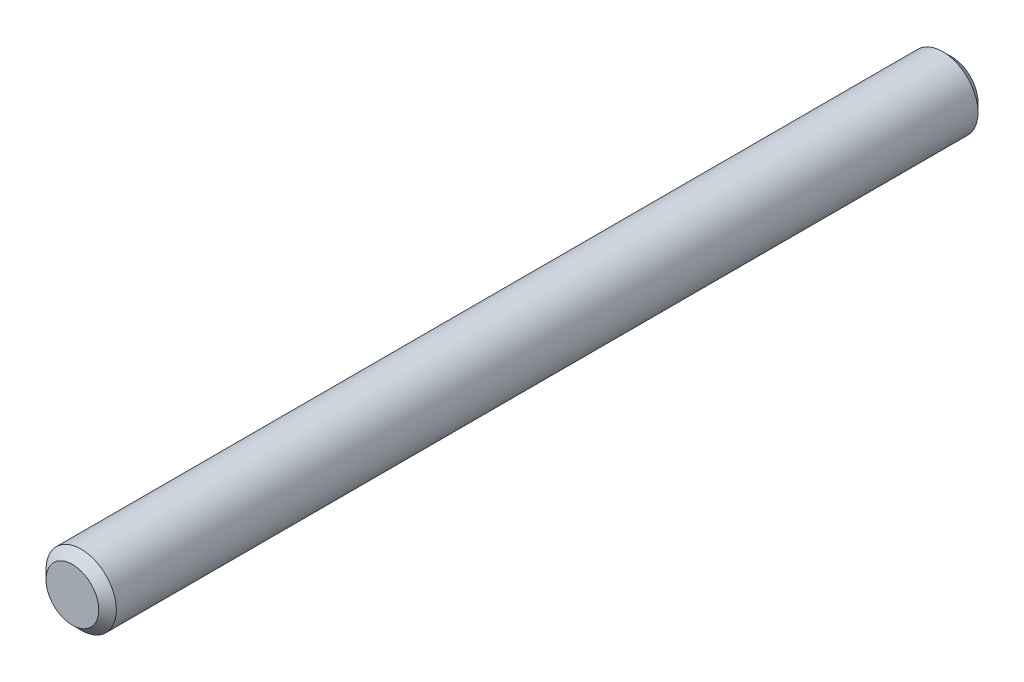
ISO-10303-21;
HEADER;
FILE_DESCRIPTION(('STEP AP214'),'2;1');
FILE_NAME('part.step','',(''),(''),'','','');
FILE_SCHEMA(('AUTOMOTIVE_DESIGN { 1 0 10303 214 1 1 1 1 }'));
ENDSEC;
DATA;
#1=APPLICATION_CONTEXT('core data for automotive mechanical design processes');
#2=APPLICATION_PROTOCOL_DEFINITION('international standard','automotive_design',2000,#1);
#3=PRODUCT_CONTEXT('',#1,'mechanical');
#4=PRODUCT('Part','Part','',(#3));
#5=PRODUCT_RELATED_PRODUCT_CATEGORY('part','',(#4));
#6=PRODUCT_DEFINITION_FORMATION('','',#4);
#7=PRODUCT_DEFINITION_CONTEXT('part definition',#1,'design');
#8=PRODUCT_DEFINITION('design','',#6,#7);
#9=PRODUCT_DEFINITION_SHAPE('','',#8);
#10=(LENGTH_UNIT() NAMED_UNIT(*) SI_UNIT(.MILLI.,.METRE.));
#11=(NAMED_UNIT(*) PLANE_ANGLE_UNIT() SI_UNIT($,.RADIAN.));
#12=(NAMED_UNIT(*) SI_UNIT($,.STERADIAN.) SOLID_ANGLE_UNIT());
#13=UNCERTAINTY_MEASURE_WITH_UNIT(LENGTH_MEASURE(1.E-05),#10,'distance_accuracy_value','');
#14=(GEOMETRIC_REPRESENTATION_CONTEXT(3) GLOBAL_UNCERTAINTY_ASSIGNED_CONTEXT((#13)) GLOBAL_UNIT_ASSIGNED_CONTEXT((#10,
#11,#12)) REPRESENTATION_CONTEXT('',''));
#15=CARTESIAN_POINT('',(0.,0.,0.));
#16=DIRECTION('',(0.,0.,1.));
#17=DIRECTION('',(1.,0.,0.));
#18=AXIS2_PLACEMENT_3D('',#15,#16,#17);
#19=CARTESIAN_POINT('',(0.,0.,-50.));
#20=DIRECTION('',(0.,0.,1.));
#21=DIRECTION('',(1.,0.,0.));
#22=AXIS2_PLACEMENT_3D('',#19,#20,#21);
#23=CYLINDRICAL_SURFACE('',#22,2.);
#24=CARTESIAN_POINT('',(0.,0.,-49.5));
#25=DIRECTION('',(0.,0.,1.));
#26=DIRECTION('',(1.,0.,0.));
#27=AXIS2_PLACEMENT_3D('',#24,#25,#26);
#28=CIRCLE('',#27,2.);
#29=CARTESIAN_POINT('',(2.,0.,-49.5));
#30=VERTEX_POINT('',#29);
#31=EDGE_CURVE('E43',#30,#30,#28,.T.);
#32=ORIENTED_EDGE('',*,*,#31,.T.);
#33=EDGE_LOOP('',(#32));
#34=FACE_BOUND('',#33,.T.);
#35=CARTESIAN_POINT('',(0.,0.,-0.5));
#36=DIRECTION('',(0.,0.,1.));
#37=DIRECTION('',(1.,0.,0.));
#38=AXIS2_PLACEMENT_3D('',#35,#36,#37);
#39=CIRCLE('',#38,2.);
#40=CARTESIAN_POINT('',(2.,0.,-0.5));
#41=VERTEX_POINT('',#40);
#42=EDGE_CURVE('E47',#41,#41,#39,.F.);
#43=ORIENTED_EDGE('',*,*,#42,.T.);
#44=EDGE_LOOP('',(#43));
#45=FACE_BOUND('',#44,.T.);
#46=ADVANCED_FACE('F32',(#34,#45),#23,.T.);
#47=CARTESIAN_POINT('',(0.,0.,-50.));
#48=DIRECTION('',(0.,0.,1.));
#49=DIRECTION('',(1.,0.,0.));
#50=AXIS2_PLACEMENT_3D('',#47,#48,#49);
#51=PLANE('',#50);
#52=CARTESIAN_POINT('',(0.,0.,-50.));
#53=DIRECTION('',(0.,0.,1.));
#54=DIRECTION('',(1.,0.,0.));
#55=AXIS2_PLACEMENT_3D('',#52,#53,#54);
#56=CIRCLE('',#55,1.5);
#57=CARTESIAN_POINT('',(1.5,0.,-50.));
#58=VERTEX_POINT('',#57);
#59=EDGE_CURVE('E39',#58,#58,#56,.F.);
#60=ORIENTED_EDGE('',*,*,#59,.T.);
#61=EDGE_LOOP('',(#60));
#62=FACE_BOUND('',#61,.T.);
#63=ADVANCED_FACE('F63',(#62),#51,.F.);
#64=CARTESIAN_POINT('',(0.,0.,0.));
#65=DIRECTION('',(0.,0.,1.));
#66=DIRECTION('',(1.,0.,0.));
#67=AXIS2_PLACEMENT_3D('',#64,#65,#66);
#68=PLANE('',#67);
#69=CARTESIAN_POINT('',(0.,0.,0.));
#70=DIRECTION('',(0.,0.,1.));
#71=DIRECTION('',(1.,0.,0.));
#72=AXIS2_PLACEMENT_3D('',#69,#70,#71);
#73=CIRCLE('',#72,1.50000000000001);
#74=CARTESIAN_POINT('',(1.50000000000001,0.,0.));
#75=VERTEX_POINT('',#74);
#76=EDGE_CURVE('E10',#75,#75,#73,.T.);
#77=ORIENTED_EDGE('',*,*,#76,.T.);
#78=EDGE_LOOP('',(#77));
#79=FACE_BOUND('',#78,.T.);
#80=ADVANCED_FACE('F60',(#79),#68,.T.);
#81=CARTESIAN_POINT('',(0.,0.,-49.5));
#82=DIRECTION('',(0.,0.,1.));
#83=DIRECTION('',(1.,0.,0.));
#84=AXIS2_PLACEMENT_3D('',#81,#82,#83);
#85=CONICAL_SURFACE('',#84,2.,0.785398163397454);
#86=ORIENTED_EDGE('',*,*,#59,.F.);
#87=EDGE_LOOP('',(#86));
#88=FACE_BOUND('',#87,.T.);
#89=ORIENTED_EDGE('',*,*,#31,.F.);
#90=EDGE_LOOP('',(#89));
#91=FACE_BOUND('',#90,.T.);
#92=ADVANCED_FACE('F56',(#88,#91),#85,.T.);
#93=CARTESIAN_POINT('',(0.,0.,0.));
#94=DIRECTION('',(0.,0.,-1.));
#95=DIRECTION('',(-1.,0.,0.));
#96=AXIS2_PLACEMENT_3D('',#93,#94,#95);
#97=CONICAL_SURFACE('',#96,1.50000000000001,0.78539816339744);
#98=ORIENTED_EDGE('',*,*,#42,.F.);
#99=EDGE_LOOP('',(#98));
#100=FACE_BOUND('',#99,.T.);
#101=ORIENTED_EDGE('',*,*,#76,.F.);
#102=EDGE_LOOP('',(#101));
#103=FACE_BOUND('',#102,.T.);
#104=ADVANCED_FACE('F34',(#100,#103),#97,.T.);
#105=CLOSED_SHELL('',(#46,#63,#80,#92,#104));
#106=MANIFOLD_SOLID_BREP('B2',#105);
#107=ADVANCED_BREP_SHAPE_REPRESENTATION('',(#18,#106),#14);
#108=SHAPE_DEFINITION_REPRESENTATION(#9,#107);
ENDSEC;
END-ISO-10303-21;
